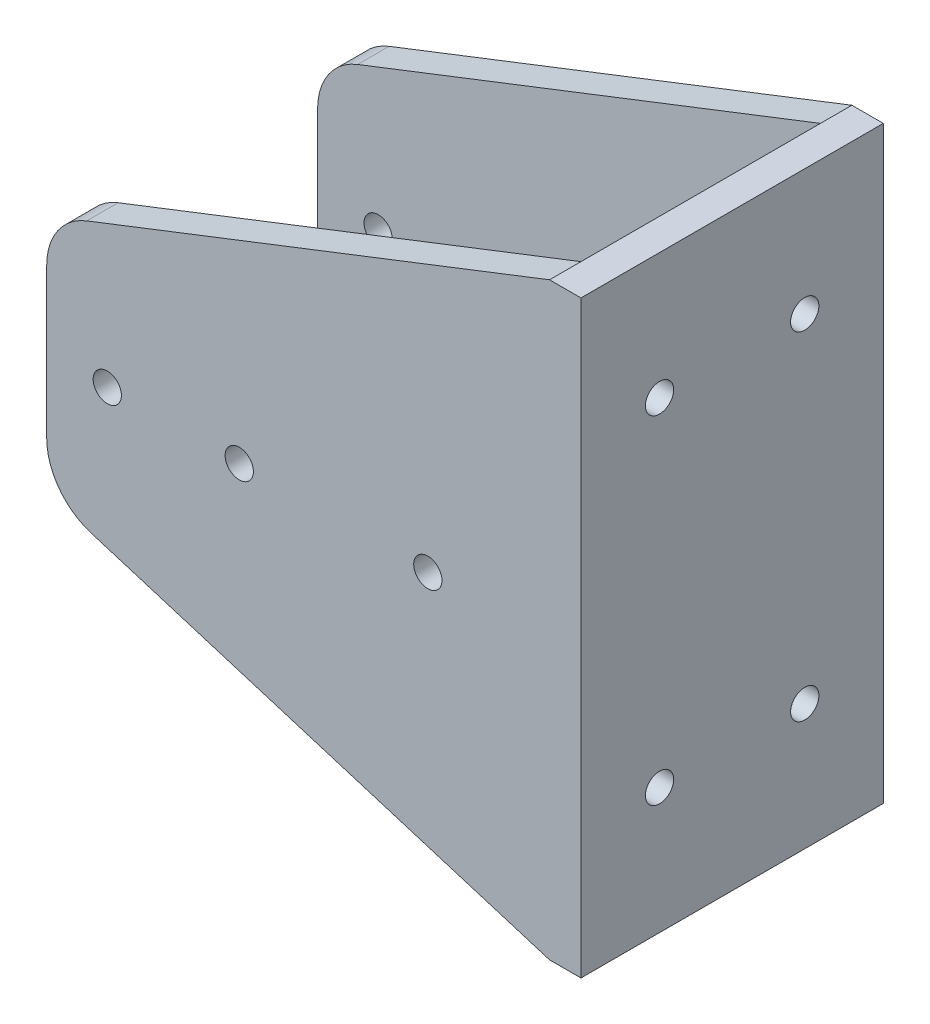
ISO-10303-21;
HEADER;
FILE_DESCRIPTION(('STEP AP214'),'2;1');
FILE_NAME('part.step','',(''),(''),'','','');
FILE_SCHEMA(('AUTOMOTIVE_DESIGN { 1 0 10303 214 1 1 1 1 }'));
ENDSEC;
DATA;
#1=APPLICATION_CONTEXT('core data for automotive mechanical design processes');
#2=APPLICATION_PROTOCOL_DEFINITION('international standard','automotive_design',2000,#1);
#3=PRODUCT_CONTEXT('',#1,'mechanical');
#4=PRODUCT('Part','Part','',(#3));
#5=PRODUCT_RELATED_PRODUCT_CATEGORY('part','',(#4));
#6=PRODUCT_DEFINITION_FORMATION('','',#4);
#7=PRODUCT_DEFINITION_CONTEXT('part definition',#1,'design');
#8=PRODUCT_DEFINITION('design','',#6,#7);
#9=PRODUCT_DEFINITION_SHAPE('','',#8);
#10=(LENGTH_UNIT() NAMED_UNIT(*) SI_UNIT(.MILLI.,.METRE.));
#11=(NAMED_UNIT(*) PLANE_ANGLE_UNIT() SI_UNIT($,.RADIAN.));
#12=(NAMED_UNIT(*) SI_UNIT($,.STERADIAN.) SOLID_ANGLE_UNIT());
#13=UNCERTAINTY_MEASURE_WITH_UNIT(LENGTH_MEASURE(1.E-05),#10,'distance_accuracy_value','');
#14=(GEOMETRIC_REPRESENTATION_CONTEXT(3) GLOBAL_UNCERTAINTY_ASSIGNED_CONTEXT((#13)) GLOBAL_UNIT_ASSIGNED_CONTEXT((#10,
#11,#12)) REPRESENTATION_CONTEXT('',''));
#15=CARTESIAN_POINT('',(0.,0.,0.));
#16=DIRECTION('',(0.,0.,1.));
#17=DIRECTION('',(1.,0.,0.));
#18=AXIS2_PLACEMENT_3D('',#15,#16,#17);
#19=CARTESIAN_POINT('',(-42.1605695000304,-11.8042707455189,5.));
#20=DIRECTION('',(0.,0.,1.));
#21=DIRECTION('',(1.,0.,0.));
#22=AXIS2_PLACEMENT_3D('',#19,#20,#21);
#23=PLANE('',#22);
#24=CARTESIAN_POINT('',(-21.5238143825873,0.,5.));
#25=DIRECTION('',(0.,0.,1.));
#26=DIRECTION('',(1.,0.,0.));
#27=AXIS2_PLACEMENT_3D('',#24,#25,#26);
#28=CIRCLE('',#27,2.25);
#29=CARTESIAN_POINT('',(-19.2738143825873,0.,5.));
#30=VERTEX_POINT('',#29);
#31=EDGE_CURVE('E198',#30,#30,#28,.T.);
#32=ORIENTED_EDGE('',*,*,#31,.F.);
#33=EDGE_LOOP('',(#32));
#34=FACE_BOUND('',#33,.T.);
#35=CARTESIAN_POINT('',(-42.1605695000304,-11.8042707455189,5.));
#36=DIRECTION('',(0.,0.,1.));
#37=DIRECTION('',(1.,0.,0.));
#38=AXIS2_PLACEMENT_3D('',#35,#36,#37);
#39=CIRCLE('',#38,10.);
#40=CARTESIAN_POINT('',(-52.1605695000304,-11.8042707455188,5.));
#41=VERTEX_POINT('',#40);
#42=CARTESIAN_POINT('',(-45.084961564147,-21.367111905725,5.));
#43=VERTEX_POINT('',#42);
#44=EDGE_CURVE('E142',#41,#43,#39,.T.);
#45=ORIENTED_EDGE('',*,*,#44,.T.);
#46=DIRECTION('',(0.956284116020608,-0.292439206411664,0.));
#47=VECTOR('',#46,1.);
#48=CARTESIAN_POINT('',(27.8394304999696,-43.6679647443428,5.));
#49=LINE('',#48,#47);
#50=CARTESIAN_POINT('',(27.8394304999696,-43.6679647443428,5.));
#51=VERTEX_POINT('',#50);
#52=EDGE_CURVE('E95',#43,#51,#49,.T.);
#53=ORIENTED_EDGE('',*,*,#52,.T.);
#54=DIRECTION('',(0.,1.,0.));
#55=VECTOR('',#54,1.);
#56=CARTESIAN_POINT('',(27.8394304999696,-43.6679647443428,5.));
#57=LINE('',#56,#55);
#58=CARTESIAN_POINT('',(27.8394304999696,50.,5.));
#59=VERTEX_POINT('',#58);
#60=EDGE_CURVE('E111',#51,#59,#57,.T.);
#61=ORIENTED_EDGE('',*,*,#60,.T.);
#62=DIRECTION('',(-0.931732044575127,-0.363146522924085,0.));
#63=VECTOR('',#62,1.);
#64=CARTESIAN_POINT('',(-45.7920347292712,21.3018235967214,5.));
#65=LINE('',#64,#63);
#66=CARTESIAN_POINT('',(-45.7920347292712,21.3018235967214,5.));
#67=VERTEX_POINT('',#66);
#68=EDGE_CURVE('E104',#59,#67,#65,.T.);
#69=ORIENTED_EDGE('',*,*,#68,.T.);
#70=CARTESIAN_POINT('',(-42.1605695000304,11.9845031509701,5.));
#71=DIRECTION('',(0.,0.,1.));
#72=DIRECTION('',(-1.,0.,0.));
#73=AXIS2_PLACEMENT_3D('',#70,#71,#72);
#74=CIRCLE('',#73,10.);
#75=CARTESIAN_POINT('',(-52.1605695000304,11.98450315097,5.));
#76=VERTEX_POINT('',#75);
#77=EDGE_CURVE('E108',#67,#76,#74,.T.);
#78=ORIENTED_EDGE('',*,*,#77,.T.);
#79=DIRECTION('',(0.,-1.,0.));
#80=VECTOR('',#79,1.);
#81=CARTESIAN_POINT('',(-52.1605695000304,-11.8042707455188,5.));
#82=LINE('',#81,#80);
#83=EDGE_CURVE('E63',#76,#41,#82,.T.);
#84=ORIENTED_EDGE('',*,*,#83,.T.);
#85=EDGE_LOOP('',(#45,#53,#61,#69,#78,#84));
#86=FACE_BOUND('',#85,.T.);
#87=CARTESIAN_POINT('',(-42.5238143825873,0.,5.));
#88=DIRECTION('',(0.,0.,1.));
#89=DIRECTION('',(1.,0.,0.));
#90=AXIS2_PLACEMENT_3D('',#87,#88,#89);
#91=CIRCLE('',#90,2.25);
#92=CARTESIAN_POINT('',(-40.2738143825873,0.,5.));
#93=VERTEX_POINT('',#92);
#94=EDGE_CURVE('E135',#93,#93,#91,.T.);
#95=ORIENTED_EDGE('',*,*,#94,.F.);
#96=EDGE_LOOP('',(#95));
#97=FACE_BOUND('',#96,.T.);
#98=CARTESIAN_POINT('',(8.47618561741272,0.,5.));
#99=DIRECTION('',(0.,0.,1.));
#100=DIRECTION('',(1.,0.,0.));
#101=AXIS2_PLACEMENT_3D('',#98,#99,#100);
#102=CIRCLE('',#101,2.25);
#103=CARTESIAN_POINT('',(10.7261856174127,0.,5.));
#104=VERTEX_POINT('',#103);
#105=EDGE_CURVE('E192',#104,#104,#102,.T.);
#106=ORIENTED_EDGE('',*,*,#105,.F.);
#107=EDGE_LOOP('',(#106));
#108=FACE_BOUND('',#107,.T.);
#109=ADVANCED_FACE('F39',(#34,#86,#97,#108),#23,.T.);
#110=CARTESIAN_POINT('',(-42.1605695000304,-11.8042707455189,0.));
#111=DIRECTION('',(0.,0.,1.));
#112=DIRECTION('',(1.,0.,0.));
#113=AXIS2_PLACEMENT_3D('',#110,#111,#112);
#114=PLANE('',#113);
#115=CARTESIAN_POINT('',(-42.1605695000304,-11.8042707455189,0.));
#116=DIRECTION('',(0.,0.,1.));
#117=DIRECTION('',(1.,0.,0.));
#118=AXIS2_PLACEMENT_3D('',#115,#116,#117);
#119=CIRCLE('',#118,10.);
#120=CARTESIAN_POINT('',(-52.1605695000304,-11.8042707455188,0.));
#121=VERTEX_POINT('',#120);
#122=CARTESIAN_POINT('',(-45.084961564147,-21.367111905725,0.));
#123=VERTEX_POINT('',#122);
#124=EDGE_CURVE('E131',#121,#123,#119,.T.);
#125=ORIENTED_EDGE('',*,*,#124,.F.);
#126=DIRECTION('',(0.,-1.,0.));
#127=VECTOR('',#126,1.);
#128=CARTESIAN_POINT('',(-52.1605695000304,-11.8042707455188,0.));
#129=LINE('',#128,#127);
#130=CARTESIAN_POINT('',(-52.1605695000304,11.98450315097,0.));
#131=VERTEX_POINT('',#130);
#132=EDGE_CURVE('E87',#131,#121,#129,.T.);
#133=ORIENTED_EDGE('',*,*,#132,.F.);
#134=CARTESIAN_POINT('',(-42.1605695000304,11.9845031509701,0.));
#135=DIRECTION('',(0.,0.,1.));
#136=DIRECTION('',(-1.,0.,0.));
#137=AXIS2_PLACEMENT_3D('',#134,#135,#136);
#138=CIRCLE('',#137,10.);
#139=CARTESIAN_POINT('',(-45.7920347292712,21.3018235967214,0.));
#140=VERTEX_POINT('',#139);
#141=EDGE_CURVE('E139',#140,#131,#138,.T.);
#142=ORIENTED_EDGE('',*,*,#141,.F.);
#143=DIRECTION('',(-0.931732044575127,-0.363146522924085,0.));
#144=VECTOR('',#143,1.);
#145=CARTESIAN_POINT('',(-45.7920347292712,21.3018235967214,0.));
#146=LINE('',#145,#144);
#147=CARTESIAN_POINT('',(27.8394304999696,50.,0.));
#148=VERTEX_POINT('',#147);
#149=EDGE_CURVE('E119',#148,#140,#146,.T.);
#150=ORIENTED_EDGE('',*,*,#149,.F.);
#151=DIRECTION('',(-1.,0.,0.));
#152=VECTOR('',#151,1.);
#153=CARTESIAN_POINT('',(32.8394304999696,50.,0.));
#154=LINE('',#153,#152);
#155=CARTESIAN_POINT('',(32.8394304999696,50.,0.));
#156=VERTEX_POINT('',#155);
#157=EDGE_CURVE('E188',#156,#148,#154,.T.);
#158=ORIENTED_EDGE('',*,*,#157,.F.);
#159=DIRECTION('',(0.,1.,0.));
#160=VECTOR('',#159,1.);
#161=CARTESIAN_POINT('',(32.8394304999696,50.,0.));
#162=LINE('',#161,#160);
#163=CARTESIAN_POINT('',(32.8394304999696,-43.7,0.));
#164=VERTEX_POINT('',#163);
#165=EDGE_CURVE('E180',#164,#156,#162,.T.);
#166=ORIENTED_EDGE('',*,*,#165,.F.);
#167=DIRECTION('',(-1.,0.,0.));
#168=VECTOR('',#167,1.);
#169=CARTESIAN_POINT('',(32.8394304999696,-43.7,0.));
#170=LINE('',#169,#168);
#171=CARTESIAN_POINT('',(27.8394304999696,-43.7,0.));
#172=VERTEX_POINT('',#171);
#173=EDGE_CURVE('E163',#164,#172,#170,.T.);
#174=ORIENTED_EDGE('',*,*,#173,.T.);
#175=DIRECTION('',(0.,1.,0.));
#176=VECTOR('',#175,1.);
#177=CARTESIAN_POINT('',(27.8394304999696,50.,0.));
#178=LINE('',#177,#176);
#179=CARTESIAN_POINT('',(27.8394304999696,-43.6679647443428,0.));
#180=VERTEX_POINT('',#179);
#181=EDGE_CURVE('E154',#172,#180,#178,.T.);
#182=ORIENTED_EDGE('',*,*,#181,.T.);
#183=DIRECTION('',(0.956284116020608,-0.292439206411664,0.));
#184=VECTOR('',#183,1.);
#185=CARTESIAN_POINT('',(27.8394304999696,-43.6679647443428,0.));
#186=LINE('',#185,#184);
#187=EDGE_CURVE('E134',#123,#180,#186,.T.);
#188=ORIENTED_EDGE('',*,*,#187,.F.);
#189=EDGE_LOOP('',(#125,#133,#142,#150,#158,#166,#174,#182,#188));
#190=FACE_BOUND('',#189,.T.);
#191=CARTESIAN_POINT('',(-42.5238143825873,0.,0.));
#192=DIRECTION('',(0.,0.,1.));
#193=DIRECTION('',(1.,0.,0.));
#194=AXIS2_PLACEMENT_3D('',#191,#192,#193);
#195=CIRCLE('',#194,2.25);
#196=CARTESIAN_POINT('',(-40.2738143825873,0.,0.));
#197=VERTEX_POINT('',#196);
#198=EDGE_CURVE('E201',#197,#197,#195,.T.);
#199=ORIENTED_EDGE('',*,*,#198,.T.);
#200=EDGE_LOOP('',(#199));
#201=FACE_BOUND('',#200,.T.);
#202=CARTESIAN_POINT('',(-21.5238143825873,0.,0.));
#203=DIRECTION('',(0.,0.,1.));
#204=DIRECTION('',(1.,0.,0.));
#205=AXIS2_PLACEMENT_3D('',#202,#203,#204);
#206=CIRCLE('',#205,2.25);
#207=CARTESIAN_POINT('',(-19.2738143825873,0.,0.));
#208=VERTEX_POINT('',#207);
#209=EDGE_CURVE('E195',#208,#208,#206,.T.);
#210=ORIENTED_EDGE('',*,*,#209,.T.);
#211=EDGE_LOOP('',(#210));
#212=FACE_BOUND('',#211,.T.);
#213=CARTESIAN_POINT('',(8.47618561741272,0.,0.));
#214=DIRECTION('',(0.,0.,1.));
#215=DIRECTION('',(1.,0.,0.));
#216=AXIS2_PLACEMENT_3D('',#213,#214,#215);
#217=CIRCLE('',#216,2.25);
#218=CARTESIAN_POINT('',(10.7261856174127,0.,0.));
#219=VERTEX_POINT('',#218);
#220=EDGE_CURVE('E191',#219,#219,#217,.T.);
#221=ORIENTED_EDGE('',*,*,#220,.T.);
#222=EDGE_LOOP('',(#221));
#223=FACE_BOUND('',#222,.T.);
#224=ADVANCED_FACE('F159',(#190,#201,#212,#223),#114,.F.);
#225=CARTESIAN_POINT('',(-42.1605695000304,-11.8042707455189,5.));
#226=DIRECTION('',(0.,0.,-1.));
#227=DIRECTION('',(-1.,0.,0.));
#228=AXIS2_PLACEMENT_3D('',#225,#226,#227);
#229=CYLINDRICAL_SURFACE('',#228,10.);
#230=ORIENTED_EDGE('',*,*,#124,.T.);
#231=DIRECTION('',(0.,0.,-1.));
#232=VECTOR('',#231,1.);
#233=CARTESIAN_POINT('',(-45.084961564147,-21.367111905725,5.));
#234=LINE('',#233,#232);
#235=EDGE_CURVE('E11',#43,#123,#234,.T.);
#236=ORIENTED_EDGE('',*,*,#235,.F.);
#237=ORIENTED_EDGE('',*,*,#44,.F.);
#238=DIRECTION('',(0.,0.,-1.));
#239=VECTOR('',#238,1.);
#240=CARTESIAN_POINT('',(-52.1605695000304,-11.8042707455188,5.));
#241=LINE('',#240,#239);
#242=EDGE_CURVE('E127',#41,#121,#241,.T.);
#243=ORIENTED_EDGE('',*,*,#242,.T.);
#244=EDGE_LOOP('',(#230,#236,#237,#243));
#245=FACE_BOUND('',#244,.T.);
#246=ADVANCED_FACE('F41',(#245),#229,.T.);
#247=CARTESIAN_POINT('',(27.8394304999696,-43.6679647443428,5.));
#248=DIRECTION('',(0.292439206411664,0.956284116020608,0.));
#249=DIRECTION('',(-0.956284116020609,0.292439206411664,0.));
#250=AXIS2_PLACEMENT_3D('',#247,#248,#249);
#251=PLANE('',#250);
#252=ORIENTED_EDGE('',*,*,#187,.T.);
#253=DIRECTION('',(0.,0.,-1.));
#254=VECTOR('',#253,1.);
#255=CARTESIAN_POINT('',(27.8394304999696,-43.6679647443428,5.));
#256=LINE('',#255,#254);
#257=EDGE_CURVE('E47',#51,#180,#256,.T.);
#258=ORIENTED_EDGE('',*,*,#257,.F.);
#259=ORIENTED_EDGE('',*,*,#52,.F.);
#260=ORIENTED_EDGE('',*,*,#235,.T.);
#261=EDGE_LOOP('',(#252,#258,#259,#260));
#262=FACE_BOUND('',#261,.T.);
#263=ADVANCED_FACE('F212',(#262),#251,.F.);
#264=CARTESIAN_POINT('',(-45.7920347292712,21.3018235967214,5.));
#265=DIRECTION('',(0.363146522924085,-0.931732044575127,0.));
#266=DIRECTION('',(0.931732044575127,0.363146522924085,0.));
#267=AXIS2_PLACEMENT_3D('',#264,#265,#266);
#268=PLANE('',#267);
#269=ORIENTED_EDGE('',*,*,#149,.T.);
#270=DIRECTION('',(0.,0.,-1.));
#271=VECTOR('',#270,1.);
#272=CARTESIAN_POINT('',(-45.7920347292712,21.3018235967214,5.));
#273=LINE('',#272,#271);
#274=EDGE_CURVE('E116',#67,#140,#273,.T.);
#275=ORIENTED_EDGE('',*,*,#274,.F.);
#276=ORIENTED_EDGE('',*,*,#68,.F.);
#277=DIRECTION('',(0.,0.,-1.));
#278=VECTOR('',#277,1.);
#279=CARTESIAN_POINT('',(27.8394304999696,50.,5.));
#280=LINE('',#279,#278);
#281=EDGE_CURVE('E122',#59,#148,#280,.T.);
#282=ORIENTED_EDGE('',*,*,#281,.T.);
#283=EDGE_LOOP('',(#269,#275,#276,#282));
#284=FACE_BOUND('',#283,.T.);
#285=ADVANCED_FACE('F117',(#284),#268,.F.);
#286=CARTESIAN_POINT('',(-42.1605695000304,11.9845031509701,5.));
#287=DIRECTION('',(0.,0.,-1.));
#288=DIRECTION('',(-1.,0.,0.));
#289=AXIS2_PLACEMENT_3D('',#286,#287,#288);
#290=CYLINDRICAL_SURFACE('',#289,10.);
#291=ORIENTED_EDGE('',*,*,#141,.T.);
#292=DIRECTION('',(0.,0.,-1.));
#293=VECTOR('',#292,1.);
#294=CARTESIAN_POINT('',(-52.1605695000304,11.98450315097,5.));
#295=LINE('',#294,#293);
#296=EDGE_CURVE('E123',#76,#131,#295,.T.);
#297=ORIENTED_EDGE('',*,*,#296,.F.);
#298=ORIENTED_EDGE('',*,*,#77,.F.);
#299=ORIENTED_EDGE('',*,*,#274,.T.);
#300=EDGE_LOOP('',(#291,#297,#298,#299));
#301=FACE_BOUND('',#300,.T.);
#302=ADVANCED_FACE('F125',(#301),#290,.T.);
#303=CARTESIAN_POINT('',(-52.1605695000304,-11.8042707455188,5.));
#304=DIRECTION('',(1.,0.,0.));
#305=DIRECTION('',(0.,1.,0.));
#306=AXIS2_PLACEMENT_3D('',#303,#304,#305);
#307=PLANE('',#306);
#308=ORIENTED_EDGE('',*,*,#132,.T.);
#309=ORIENTED_EDGE('',*,*,#242,.F.);
#310=ORIENTED_EDGE('',*,*,#83,.F.);
#311=ORIENTED_EDGE('',*,*,#296,.T.);
#312=EDGE_LOOP('',(#308,#309,#310,#311));
#313=FACE_BOUND('',#312,.T.);
#314=ADVANCED_FACE('F232',(#313),#307,.F.);
#315=CARTESIAN_POINT('',(-42.5238143825873,0.,5.));
#316=DIRECTION('',(0.,0.,-1.));
#317=DIRECTION('',(-1.,0.,0.));
#318=AXIS2_PLACEMENT_3D('',#315,#316,#317);
#319=CYLINDRICAL_SURFACE('',#318,2.25);
#320=ORIENTED_EDGE('',*,*,#94,.T.);
#321=EDGE_LOOP('',(#320));
#322=FACE_BOUND('',#321,.T.);
#323=ORIENTED_EDGE('',*,*,#198,.F.);
#324=EDGE_LOOP('',(#323));
#325=FACE_BOUND('',#324,.T.);
#326=ADVANCED_FACE('F229',(#322,#325),#319,.F.);
#327=CARTESIAN_POINT('',(-21.5238143825873,0.,5.));
#328=DIRECTION('',(0.,0.,-1.));
#329=DIRECTION('',(-1.,0.,0.));
#330=AXIS2_PLACEMENT_3D('',#327,#328,#329);
#331=CYLINDRICAL_SURFACE('',#330,2.25);
#332=ORIENTED_EDGE('',*,*,#31,.T.);
#333=EDGE_LOOP('',(#332));
#334=FACE_BOUND('',#333,.T.);
#335=ORIENTED_EDGE('',*,*,#209,.F.);
#336=EDGE_LOOP('',(#335));
#337=FACE_BOUND('',#336,.T.);
#338=ADVANCED_FACE('F253',(#334,#337),#331,.F.);
#339=CARTESIAN_POINT('',(8.47618561741272,0.,5.));
#340=DIRECTION('',(0.,0.,-1.));
#341=DIRECTION('',(-1.,0.,0.));
#342=AXIS2_PLACEMENT_3D('',#339,#340,#341);
#343=CYLINDRICAL_SURFACE('',#342,2.25);
#344=ORIENTED_EDGE('',*,*,#105,.T.);
#345=EDGE_LOOP('',(#344));
#346=FACE_BOUND('',#345,.T.);
#347=ORIENTED_EDGE('',*,*,#220,.F.);
#348=EDGE_LOOP('',(#347));
#349=FACE_BOUND('',#348,.T.);
#350=ADVANCED_FACE('F260',(#346,#349),#343,.F.);
#351=CARTESIAN_POINT('',(27.8394304999696,0.,0.));
#352=DIRECTION('',(-1.,0.,0.));
#353=DIRECTION('',(0.,-1.,0.));
#354=AXIS2_PLACEMENT_3D('',#351,#352,#353);
#355=PLANE('',#354);
#356=DIRECTION('',(0.,1.,0.));
#357=VECTOR('',#356,1.);
#358=CARTESIAN_POINT('',(27.8394304999696,50.,43.1));
#359=LINE('',#358,#357);
#360=CARTESIAN_POINT('',(27.8394304999696,-43.7,43.1));
#361=VERTEX_POINT('',#360);
#362=CARTESIAN_POINT('',(27.8394304999696,50.,43.1));
#363=VERTEX_POINT('',#362);
#364=EDGE_CURVE('E484',#361,#363,#359,.T.);
#365=ORIENTED_EDGE('',*,*,#364,.T.);
#366=DIRECTION('',(0.,0.,1.));
#367=VECTOR('',#366,1.);
#368=CARTESIAN_POINT('',(27.8394304999696,50.,0.));
#369=LINE('',#368,#367);
#370=EDGE_CURVE('E164',#59,#363,#369,.T.);
#371=ORIENTED_EDGE('',*,*,#370,.F.);
#372=ORIENTED_EDGE('',*,*,#60,.F.);
#373=ORIENTED_EDGE('',*,*,#257,.T.);
#374=ORIENTED_EDGE('',*,*,#181,.F.);
#375=DIRECTION('',(0.,0.,-1.));
#376=VECTOR('',#375,1.);
#377=CARTESIAN_POINT('',(27.8394304999696,-43.7,0.));
#378=LINE('',#377,#376);
#379=EDGE_CURVE('E168',#361,#172,#378,.T.);
#380=ORIENTED_EDGE('',*,*,#379,.F.);
#381=EDGE_LOOP('',(#365,#371,#372,#373,#374,#380));
#382=FACE_BOUND('',#381,.T.);
#383=CARTESIAN_POINT('',(27.8394304999696,-23.7,12.5));
#384=DIRECTION('',(1.,0.,0.));
#385=DIRECTION('',(0.,1.,0.));
#386=AXIS2_PLACEMENT_3D('',#383,#384,#385);
#387=CIRCLE('',#386,2.25);
#388=CARTESIAN_POINT('',(27.8394304999696,-21.45,12.5));
#389=VERTEX_POINT('',#388);
#390=EDGE_CURVE('E517',#389,#389,#387,.T.);
#391=ORIENTED_EDGE('',*,*,#390,.T.);
#392=EDGE_LOOP('',(#391));
#393=FACE_BOUND('',#392,.T.);
#394=CARTESIAN_POINT('',(27.8394304999696,30.,12.5));
#395=DIRECTION('',(1.,0.,0.));
#396=DIRECTION('',(0.,1.,0.));
#397=AXIS2_PLACEMENT_3D('',#394,#395,#396);
#398=CIRCLE('',#397,2.25);
#399=CARTESIAN_POINT('',(27.8394304999696,32.25,12.5));
#400=VERTEX_POINT('',#399);
#401=EDGE_CURVE('E538',#400,#400,#398,.T.);
#402=ORIENTED_EDGE('',*,*,#401,.T.);
#403=EDGE_LOOP('',(#402));
#404=FACE_BOUND('',#403,.T.);
#405=CARTESIAN_POINT('',(27.8394304999696,30.,35.6));
#406=DIRECTION('',(1.,0.,0.));
#407=DIRECTION('',(0.,1.,0.));
#408=AXIS2_PLACEMENT_3D('',#405,#406,#407);
#409=CIRCLE('',#408,2.25);
#410=CARTESIAN_POINT('',(27.8394304999696,32.25,35.6));
#411=VERTEX_POINT('',#410);
#412=EDGE_CURVE('E171',#411,#411,#409,.T.);
#413=ORIENTED_EDGE('',*,*,#412,.T.);
#414=EDGE_LOOP('',(#413));
#415=FACE_BOUND('',#414,.T.);
#416=CARTESIAN_POINT('',(27.8394304999696,-23.7,35.6));
#417=DIRECTION('',(1.,0.,0.));
#418=DIRECTION('',(0.,1.,0.));
#419=AXIS2_PLACEMENT_3D('',#416,#417,#418);
#420=CIRCLE('',#419,2.25);
#421=CARTESIAN_POINT('',(27.8394304999696,-21.45,35.6));
#422=VERTEX_POINT('',#421);
#423=EDGE_CURVE('E532',#422,#422,#420,.T.);
#424=ORIENTED_EDGE('',*,*,#423,.T.);
#425=EDGE_LOOP('',(#424));
#426=FACE_BOUND('',#425,.T.);
#427=ADVANCED_FACE('F150',(#382,#393,#404,#415,#426),#355,.T.);
#428=CARTESIAN_POINT('',(32.8394304999696,0.,0.));
#429=DIRECTION('',(-1.,0.,0.));
#430=DIRECTION('',(0.,-1.,0.));
#431=AXIS2_PLACEMENT_3D('',#428,#429,#430);
#432=PLANE('',#431);
#433=ORIENTED_EDGE('',*,*,#165,.T.);
#434=DIRECTION('',(0.,0.,1.));
#435=VECTOR('',#434,1.);
#436=CARTESIAN_POINT('',(32.8394304999696,50.,0.));
#437=LINE('',#436,#435);
#438=CARTESIAN_POINT('',(32.8394304999696,50.,48.1));
#439=VERTEX_POINT('',#438);
#440=EDGE_CURVE('E550',#156,#439,#437,.T.);
#441=ORIENTED_EDGE('',*,*,#440,.T.);
#442=DIRECTION('',(0.,-1.,0.));
#443=VECTOR('',#442,1.);
#444=CARTESIAN_POINT('',(32.8394304999696,50.,48.1));
#445=LINE('',#444,#443);
#446=CARTESIAN_POINT('',(32.8394304999696,-43.7,48.1));
#447=VERTEX_POINT('',#446);
#448=EDGE_CURVE('E552',#439,#447,#445,.T.);
#449=ORIENTED_EDGE('',*,*,#448,.T.);
#450=DIRECTION('',(0.,0.,-1.));
#451=VECTOR('',#450,1.);
#452=CARTESIAN_POINT('',(32.8394304999696,-43.7,0.));
#453=LINE('',#452,#451);
#454=EDGE_CURVE('E174',#447,#164,#453,.T.);
#455=ORIENTED_EDGE('',*,*,#454,.T.);
#456=EDGE_LOOP('',(#433,#441,#449,#455));
#457=FACE_BOUND('',#456,.T.);
#458=CARTESIAN_POINT('',(32.8394304999696,30.,35.6));
#459=DIRECTION('',(1.,0.,0.));
#460=DIRECTION('',(0.,1.,0.));
#461=AXIS2_PLACEMENT_3D('',#458,#459,#460);
#462=CIRCLE('',#461,2.25);
#463=CARTESIAN_POINT('',(32.8394304999696,32.25,35.6));
#464=VERTEX_POINT('',#463);
#465=EDGE_CURVE('E165',#464,#464,#462,.T.);
#466=ORIENTED_EDGE('',*,*,#465,.F.);
#467=EDGE_LOOP('',(#466));
#468=FACE_BOUND('',#467,.T.);
#469=CARTESIAN_POINT('',(32.8394304999696,30.,12.5));
#470=DIRECTION('',(1.,0.,0.));
#471=DIRECTION('',(0.,1.,0.));
#472=AXIS2_PLACEMENT_3D('',#469,#470,#471);
#473=CIRCLE('',#472,2.25);
#474=CARTESIAN_POINT('',(32.8394304999696,32.25,12.5));
#475=VERTEX_POINT('',#474);
#476=EDGE_CURVE('E541',#475,#475,#473,.T.);
#477=ORIENTED_EDGE('',*,*,#476,.F.);
#478=EDGE_LOOP('',(#477));
#479=FACE_BOUND('',#478,.T.);
#480=CARTESIAN_POINT('',(32.8394304999696,-23.7,35.6));
#481=DIRECTION('',(1.,0.,0.));
#482=DIRECTION('',(0.,1.,0.));
#483=AXIS2_PLACEMENT_3D('',#480,#481,#482);
#484=CIRCLE('',#483,2.25);
#485=CARTESIAN_POINT('',(32.8394304999696,-21.45,35.6));
#486=VERTEX_POINT('',#485);
#487=EDGE_CURVE('E535',#486,#486,#484,.T.);
#488=ORIENTED_EDGE('',*,*,#487,.F.);
#489=EDGE_LOOP('',(#488));
#490=FACE_BOUND('',#489,.T.);
#491=CARTESIAN_POINT('',(32.8394304999696,-23.7,12.5));
#492=DIRECTION('',(1.,0.,0.));
#493=DIRECTION('',(0.,1.,0.));
#494=AXIS2_PLACEMENT_3D('',#491,#492,#493);
#495=CIRCLE('',#494,2.25);
#496=CARTESIAN_POINT('',(32.8394304999696,-21.45,12.5));
#497=VERTEX_POINT('',#496);
#498=EDGE_CURVE('E529',#497,#497,#495,.T.);
#499=ORIENTED_EDGE('',*,*,#498,.F.);
#500=EDGE_LOOP('',(#499));
#501=FACE_BOUND('',#500,.T.);
#502=ADVANCED_FACE('F287',(#457,#468,#479,#490,#501),#432,.F.);
#503=CARTESIAN_POINT('',(32.8394304999696,50.,0.));
#504=DIRECTION('',(0.,-1.,0.));
#505=DIRECTION('',(1.,0.,0.));
#506=AXIS2_PLACEMENT_3D('',#503,#504,#505);
#507=PLANE('',#506);
#508=ORIENTED_EDGE('',*,*,#281,.F.);
#509=ORIENTED_EDGE('',*,*,#370,.T.);
#510=DIRECTION('',(0.,0.,1.));
#511=VECTOR('',#510,1.);
#512=CARTESIAN_POINT('',(27.8394304999696,50.,43.1));
#513=LINE('',#512,#511);
#514=CARTESIAN_POINT('',(27.8394304999696,50.,48.1));
#515=VERTEX_POINT('',#514);
#516=EDGE_CURVE('E500',#363,#515,#513,.T.);
#517=ORIENTED_EDGE('',*,*,#516,.T.);
#518=DIRECTION('',(-1.,0.,0.));
#519=VECTOR('',#518,1.);
#520=CARTESIAN_POINT('',(32.8394304999696,50.,48.1));
#521=LINE('',#520,#519);
#522=EDGE_CURVE('E185',#439,#515,#521,.T.);
#523=ORIENTED_EDGE('',*,*,#522,.F.);
#524=ORIENTED_EDGE('',*,*,#440,.F.);
#525=ORIENTED_EDGE('',*,*,#157,.T.);
#526=EDGE_LOOP('',(#508,#509,#517,#523,#524,#525));
#527=FACE_BOUND('',#526,.T.);
#528=ADVANCED_FACE('F298',(#527),#507,.F.);
#529=CARTESIAN_POINT('',(32.8394304999696,50.,48.1));
#530=DIRECTION('',(0.,0.,-1.));
#531=DIRECTION('',(0.,1.,0.));
#532=AXIS2_PLACEMENT_3D('',#529,#530,#531);
#533=PLANE('',#532);
#534=ORIENTED_EDGE('',*,*,#522,.T.);
#535=DIRECTION('',(-0.931732044575127,-0.363146522924085,0.));
#536=VECTOR('',#535,1.);
#537=CARTESIAN_POINT('',(27.8394304999696,50.,48.1));
#538=LINE('',#537,#536);
#539=CARTESIAN_POINT('',(-45.7920347292712,21.3018235967214,48.1));
#540=VERTEX_POINT('',#539);
#541=EDGE_CURVE('E481',#515,#540,#538,.T.);
#542=ORIENTED_EDGE('',*,*,#541,.T.);
#543=CARTESIAN_POINT('',(-42.1605695000304,11.9845031509701,48.1));
#544=DIRECTION('',(0.,0.,1.));
#545=DIRECTION('',(-1.,0.,0.));
#546=AXIS2_PLACEMENT_3D('',#543,#544,#545);
#547=CIRCLE('',#546,10.);
#548=CARTESIAN_POINT('',(-52.1605695000304,11.9845031509701,48.1));
#549=VERTEX_POINT('',#548);
#550=EDGE_CURVE('E503',#540,#549,#547,.T.);
#551=ORIENTED_EDGE('',*,*,#550,.T.);
#552=DIRECTION('',(0.,-1.,0.));
#553=VECTOR('',#552,1.);
#554=CARTESIAN_POINT('',(-52.1605695000304,-11.8042707455188,48.1));
#555=LINE('',#554,#553);
#556=CARTESIAN_POINT('',(-52.1605695000304,-11.8042707455188,48.1));
#557=VERTEX_POINT('',#556);
#558=EDGE_CURVE('E506',#549,#557,#555,.T.);
#559=ORIENTED_EDGE('',*,*,#558,.T.);
#560=CARTESIAN_POINT('',(-42.1605695000304,-11.8042707455189,48.1));
#561=DIRECTION('',(0.,0.,1.));
#562=DIRECTION('',(-1.,0.,0.));
#563=AXIS2_PLACEMENT_3D('',#560,#561,#562);
#564=CIRCLE('',#563,10.);
#565=CARTESIAN_POINT('',(-45.084961564147,-21.367111905725,48.1));
#566=VERTEX_POINT('',#565);
#567=EDGE_CURVE('E509',#557,#566,#564,.T.);
#568=ORIENTED_EDGE('',*,*,#567,.T.);
#569=DIRECTION('',(0.956166573066795,-0.292823299192023,0.));
#570=VECTOR('',#569,1.);
#571=CARTESIAN_POINT('',(27.8394304999696,-43.7,48.1));
#572=LINE('',#571,#570);
#573=CARTESIAN_POINT('',(27.8394304999696,-43.7,48.1));
#574=VERTEX_POINT('',#573);
#575=EDGE_CURVE('E487',#566,#574,#572,.T.);
#576=ORIENTED_EDGE('',*,*,#575,.T.);
#577=DIRECTION('',(-1.,0.,0.));
#578=VECTOR('',#577,1.);
#579=CARTESIAN_POINT('',(32.8394304999696,-43.7,48.1));
#580=LINE('',#579,#578);
#581=EDGE_CURVE('E182',#447,#574,#580,.T.);
#582=ORIENTED_EDGE('',*,*,#581,.F.);
#583=ORIENTED_EDGE('',*,*,#448,.F.);
#584=EDGE_LOOP('',(#534,#542,#551,#559,#568,#576,#582,#583));
#585=FACE_BOUND('',#584,.T.);
#586=CARTESIAN_POINT('',(8.47618561741272,0.,48.1));
#587=DIRECTION('',(0.,0.,1.));
#588=DIRECTION('',(1.,0.,0.));
#589=AXIS2_PLACEMENT_3D('',#586,#587,#588);
#590=CIRCLE('',#589,2.25);
#591=CARTESIAN_POINT('',(10.7261856174127,0.,48.1));
#592=VERTEX_POINT('',#591);
#593=EDGE_CURVE('E466',#592,#592,#590,.T.);
#594=ORIENTED_EDGE('',*,*,#593,.F.);
#595=EDGE_LOOP('',(#594));
#596=FACE_BOUND('',#595,.T.);
#597=CARTESIAN_POINT('',(-42.5238143825873,0.,48.1));
#598=DIRECTION('',(0.,0.,1.));
#599=DIRECTION('',(1.,0.,0.));
#600=AXIS2_PLACEMENT_3D('',#597,#598,#599);
#601=CIRCLE('',#600,2.25);
#602=CARTESIAN_POINT('',(-40.2738143825873,0.,48.1));
#603=VERTEX_POINT('',#602);
#604=EDGE_CURVE('E469',#603,#603,#601,.T.);
#605=ORIENTED_EDGE('',*,*,#604,.F.);
#606=EDGE_LOOP('',(#605));
#607=FACE_BOUND('',#606,.T.);
#608=CARTESIAN_POINT('',(-21.5238143825873,0.,48.1));
#609=DIRECTION('',(0.,0.,1.));
#610=DIRECTION('',(1.,0.,0.));
#611=AXIS2_PLACEMENT_3D('',#608,#609,#610);
#612=CIRCLE('',#611,2.25);
#613=CARTESIAN_POINT('',(-19.2738143825873,0.,48.1));
#614=VERTEX_POINT('',#613);
#615=EDGE_CURVE('E475',#614,#614,#612,.T.);
#616=ORIENTED_EDGE('',*,*,#615,.F.);
#617=EDGE_LOOP('',(#616));
#618=FACE_BOUND('',#617,.T.);
#619=ADVANCED_FACE('F308',(#585,#596,#607,#618),#533,.F.);
#620=CARTESIAN_POINT('',(32.8394304999696,-43.7,0.));
#621=DIRECTION('',(0.,1.,0.));
#622=DIRECTION('',(0.,0.,1.));
#623=AXIS2_PLACEMENT_3D('',#620,#621,#622);
#624=PLANE('',#623);
#625=EDGE_CURVE('E177',#574,#361,#378,.T.);
#626=ORIENTED_EDGE('',*,*,#625,.T.);
#627=ORIENTED_EDGE('',*,*,#379,.T.);
#628=ORIENTED_EDGE('',*,*,#173,.F.);
#629=ORIENTED_EDGE('',*,*,#454,.F.);
#630=ORIENTED_EDGE('',*,*,#581,.T.);
#631=EDGE_LOOP('',(#626,#627,#628,#629,#630));
#632=FACE_BOUND('',#631,.T.);
#633=ADVANCED_FACE('F319',(#632),#624,.F.);
#634=CARTESIAN_POINT('',(32.8394304999696,30.,35.6));
#635=DIRECTION('',(-1.,0.,0.));
#636=DIRECTION('',(0.,-1.,0.));
#637=AXIS2_PLACEMENT_3D('',#634,#635,#636);
#638=CYLINDRICAL_SURFACE('',#637,2.25);
#639=ORIENTED_EDGE('',*,*,#465,.T.);
#640=EDGE_LOOP('',(#639));
#641=FACE_BOUND('',#640,.T.);
#642=ORIENTED_EDGE('',*,*,#412,.F.);
#643=EDGE_LOOP('',(#642));
#644=FACE_BOUND('',#643,.T.);
#645=ADVANCED_FACE('F332',(#641,#644),#638,.F.);
#646=CARTESIAN_POINT('',(32.8394304999696,30.,12.5));
#647=DIRECTION('',(-1.,0.,0.));
#648=DIRECTION('',(0.,-1.,0.));
#649=AXIS2_PLACEMENT_3D('',#646,#647,#648);
#650=CYLINDRICAL_SURFACE('',#649,2.25);
#651=ORIENTED_EDGE('',*,*,#476,.T.);
#652=EDGE_LOOP('',(#651));
#653=FACE_BOUND('',#652,.T.);
#654=ORIENTED_EDGE('',*,*,#401,.F.);
#655=EDGE_LOOP('',(#654));
#656=FACE_BOUND('',#655,.T.);
#657=ADVANCED_FACE('F342',(#653,#656),#650,.F.);
#658=CARTESIAN_POINT('',(32.8394304999696,-23.7,35.6));
#659=DIRECTION('',(-1.,0.,0.));
#660=DIRECTION('',(0.,-1.,0.));
#661=AXIS2_PLACEMENT_3D('',#658,#659,#660);
#662=CYLINDRICAL_SURFACE('',#661,2.25);
#663=ORIENTED_EDGE('',*,*,#487,.T.);
#664=EDGE_LOOP('',(#663));
#665=FACE_BOUND('',#664,.T.);
#666=ORIENTED_EDGE('',*,*,#423,.F.);
#667=EDGE_LOOP('',(#666));
#668=FACE_BOUND('',#667,.T.);
#669=ADVANCED_FACE('F352',(#665,#668),#662,.F.);
#670=CARTESIAN_POINT('',(32.8394304999696,-23.7,12.5));
#671=DIRECTION('',(-1.,0.,0.));
#672=DIRECTION('',(0.,-1.,0.));
#673=AXIS2_PLACEMENT_3D('',#670,#671,#672);
#674=CYLINDRICAL_SURFACE('',#673,2.25);
#675=ORIENTED_EDGE('',*,*,#498,.T.);
#676=EDGE_LOOP('',(#675));
#677=FACE_BOUND('',#676,.T.);
#678=ORIENTED_EDGE('',*,*,#390,.F.);
#679=EDGE_LOOP('',(#678));
#680=FACE_BOUND('',#679,.T.);
#681=ADVANCED_FACE('F361',(#677,#680),#674,.F.);
#682=CARTESIAN_POINT('',(27.8394304999696,-43.7,43.1));
#683=DIRECTION('',(-0.292823299192023,-0.956166573066795,0.));
#684=DIRECTION('',(0.956166573066795,-0.292823299192023,0.));
#685=AXIS2_PLACEMENT_3D('',#682,#683,#684);
#686=PLANE('',#685);
#687=ORIENTED_EDGE('',*,*,#575,.F.);
#688=DIRECTION('',(0.,0.,1.));
#689=VECTOR('',#688,1.);
#690=CARTESIAN_POINT('',(-45.084961564147,-21.367111905725,43.1));
#691=LINE('',#690,#689);
#692=CARTESIAN_POINT('',(-45.084961564147,-21.367111905725,43.1));
#693=VERTEX_POINT('',#692);
#694=EDGE_CURVE('E514',#693,#566,#691,.T.);
#695=ORIENTED_EDGE('',*,*,#694,.F.);
#696=DIRECTION('',(0.956166573066795,-0.292823299192023,0.));
#697=VECTOR('',#696,1.);
#698=CARTESIAN_POINT('',(27.8394304999696,-43.7,43.1));
#699=LINE('',#698,#697);
#700=EDGE_CURVE('E54',#693,#361,#699,.T.);
#701=ORIENTED_EDGE('',*,*,#700,.T.);
#702=ORIENTED_EDGE('',*,*,#625,.F.);
#703=EDGE_LOOP('',(#687,#695,#701,#702));
#704=FACE_BOUND('',#703,.T.);
#705=ADVANCED_FACE('F369',(#704),#686,.T.);
#706=CARTESIAN_POINT('',(-42.1605695000304,-11.8042707455189,43.1));
#707=DIRECTION('',(0.,0.,1.));
#708=DIRECTION('',(1.,0.,0.));
#709=AXIS2_PLACEMENT_3D('',#706,#707,#708);
#710=CYLINDRICAL_SURFACE('',#709,10.);
#711=ORIENTED_EDGE('',*,*,#567,.F.);
#712=DIRECTION('',(0.,0.,1.));
#713=VECTOR('',#712,1.);
#714=CARTESIAN_POINT('',(-52.1605695000304,-11.8042707455188,43.1));
#715=LINE('',#714,#713);
#716=CARTESIAN_POINT('',(-52.1605695000304,-11.8042707455188,43.1));
#717=VERTEX_POINT('',#716);
#718=EDGE_CURVE('E518',#717,#557,#715,.T.);
#719=ORIENTED_EDGE('',*,*,#718,.F.);
#720=CARTESIAN_POINT('',(-42.1605695000304,-11.8042707455189,43.1));
#721=DIRECTION('',(0.,0.,1.));
#722=DIRECTION('',(-1.,0.,0.));
#723=AXIS2_PLACEMENT_3D('',#720,#721,#722);
#724=CIRCLE('',#723,10.);
#725=EDGE_CURVE('E496',#717,#693,#724,.T.);
#726=ORIENTED_EDGE('',*,*,#725,.T.);
#727=ORIENTED_EDGE('',*,*,#694,.T.);
#728=EDGE_LOOP('',(#711,#719,#726,#727));
#729=FACE_BOUND('',#728,.T.);
#730=ADVANCED_FACE('F377',(#729),#710,.T.);
#731=CARTESIAN_POINT('',(-52.1605695000304,-11.8042707455188,43.1));
#732=DIRECTION('',(-1.,0.,0.));
#733=DIRECTION('',(0.,-1.,0.));
#734=AXIS2_PLACEMENT_3D('',#731,#732,#733);
#735=PLANE('',#734);
#736=ORIENTED_EDGE('',*,*,#558,.F.);
#737=DIRECTION('',(0.,0.,1.));
#738=VECTOR('',#737,1.);
#739=CARTESIAN_POINT('',(-52.1605695000304,11.9845031509701,43.1));
#740=LINE('',#739,#738);
#741=CARTESIAN_POINT('',(-52.1605695000304,11.9845031509701,43.1));
#742=VERTEX_POINT('',#741);
#743=EDGE_CURVE('E521',#742,#549,#740,.T.);
#744=ORIENTED_EDGE('',*,*,#743,.F.);
#745=DIRECTION('',(0.,-1.,0.));
#746=VECTOR('',#745,1.);
#747=CARTESIAN_POINT('',(-52.1605695000304,-11.8042707455188,43.1));
#748=LINE('',#747,#746);
#749=EDGE_CURVE('E493',#742,#717,#748,.T.);
#750=ORIENTED_EDGE('',*,*,#749,.T.);
#751=ORIENTED_EDGE('',*,*,#718,.T.);
#752=EDGE_LOOP('',(#736,#744,#750,#751));
#753=FACE_BOUND('',#752,.T.);
#754=ADVANCED_FACE('F385',(#753),#735,.T.);
#755=CARTESIAN_POINT('',(-42.1605695000304,11.9845031509701,43.1));
#756=DIRECTION('',(0.,0.,1.));
#757=DIRECTION('',(1.,0.,0.));
#758=AXIS2_PLACEMENT_3D('',#755,#756,#757);
#759=CYLINDRICAL_SURFACE('',#758,10.);
#760=ORIENTED_EDGE('',*,*,#550,.F.);
#761=DIRECTION('',(0.,0.,1.));
#762=VECTOR('',#761,1.);
#763=CARTESIAN_POINT('',(-45.7920347292712,21.3018235967214,43.1));
#764=LINE('',#763,#762);
#765=CARTESIAN_POINT('',(-45.7920347292712,21.3018235967214,43.1));
#766=VERTEX_POINT('',#765);
#767=EDGE_CURVE('E524',#766,#540,#764,.T.);
#768=ORIENTED_EDGE('',*,*,#767,.F.);
#769=CARTESIAN_POINT('',(-42.1605695000304,11.9845031509701,43.1));
#770=DIRECTION('',(0.,0.,1.));
#771=DIRECTION('',(-1.,0.,0.));
#772=AXIS2_PLACEMENT_3D('',#769,#770,#771);
#773=CIRCLE('',#772,10.);
#774=EDGE_CURVE('E490',#766,#742,#773,.T.);
#775=ORIENTED_EDGE('',*,*,#774,.T.);
#776=ORIENTED_EDGE('',*,*,#743,.T.);
#777=EDGE_LOOP('',(#760,#768,#775,#776));
#778=FACE_BOUND('',#777,.T.);
#779=ADVANCED_FACE('F394',(#778),#759,.T.);
#780=CARTESIAN_POINT('',(27.8394304999696,50.,43.1));
#781=DIRECTION('',(-0.363146522924085,0.931732044575127,0.));
#782=DIRECTION('',(-0.931732044575127,-0.363146522924085,0.));
#783=AXIS2_PLACEMENT_3D('',#780,#781,#782);
#784=PLANE('',#783);
#785=ORIENTED_EDGE('',*,*,#541,.F.);
#786=ORIENTED_EDGE('',*,*,#516,.F.);
#787=DIRECTION('',(-0.931732044575127,-0.363146522924085,0.));
#788=VECTOR('',#787,1.);
#789=CARTESIAN_POINT('',(27.8394304999696,50.,43.1));
#790=LINE('',#789,#788);
#791=EDGE_CURVE('E486',#363,#766,#790,.T.);
#792=ORIENTED_EDGE('',*,*,#791,.T.);
#793=ORIENTED_EDGE('',*,*,#767,.T.);
#794=EDGE_LOOP('',(#785,#786,#792,#793));
#795=FACE_BOUND('',#794,.T.);
#796=ADVANCED_FACE('F403',(#795),#784,.T.);
#797=CARTESIAN_POINT('',(-42.1605695000304,-11.8042707455189,43.1));
#798=DIRECTION('',(0.,0.,-1.));
#799=DIRECTION('',(-1.,0.,0.));
#800=AXIS2_PLACEMENT_3D('',#797,#798,#799);
#801=PLANE('',#800);
#802=CARTESIAN_POINT('',(8.47618561741272,0.,43.1));
#803=DIRECTION('',(0.,0.,1.));
#804=DIRECTION('',(1.,0.,0.));
#805=AXIS2_PLACEMENT_3D('',#802,#803,#804);
#806=CIRCLE('',#805,2.25);
#807=CARTESIAN_POINT('',(10.7261856174127,0.,43.1));
#808=VERTEX_POINT('',#807);
#809=EDGE_CURVE('E463',#808,#808,#806,.T.);
#810=ORIENTED_EDGE('',*,*,#809,.T.);
#811=EDGE_LOOP('',(#810));
#812=FACE_BOUND('',#811,.T.);
#813=CARTESIAN_POINT('',(-42.5238143825873,0.,43.1));
#814=DIRECTION('',(0.,0.,1.));
#815=DIRECTION('',(1.,0.,0.));
#816=AXIS2_PLACEMENT_3D('',#813,#814,#815);
#817=CIRCLE('',#816,2.25);
#818=CARTESIAN_POINT('',(-40.2738143825873,0.,43.1));
#819=VERTEX_POINT('',#818);
#820=EDGE_CURVE('E472',#819,#819,#817,.T.);
#821=ORIENTED_EDGE('',*,*,#820,.T.);
#822=EDGE_LOOP('',(#821));
#823=FACE_BOUND('',#822,.T.);
#824=CARTESIAN_POINT('',(-21.5238143825873,0.,43.1));
#825=DIRECTION('',(0.,0.,1.));
#826=DIRECTION('',(1.,0.,0.));
#827=AXIS2_PLACEMENT_3D('',#824,#825,#826);
#828=CIRCLE('',#827,2.25);
#829=CARTESIAN_POINT('',(-19.2738143825873,0.,43.1));
#830=VERTEX_POINT('',#829);
#831=EDGE_CURVE('E478',#830,#830,#828,.T.);
#832=ORIENTED_EDGE('',*,*,#831,.T.);
#833=EDGE_LOOP('',(#832));
#834=FACE_BOUND('',#833,.T.);
#835=ORIENTED_EDGE('',*,*,#364,.F.);
#836=ORIENTED_EDGE('',*,*,#700,.F.);
#837=ORIENTED_EDGE('',*,*,#725,.F.);
#838=ORIENTED_EDGE('',*,*,#749,.F.);
#839=ORIENTED_EDGE('',*,*,#774,.F.);
#840=ORIENTED_EDGE('',*,*,#791,.F.);
#841=EDGE_LOOP('',(#835,#836,#837,#838,#839,#840));
#842=FACE_BOUND('',#841,.T.);
#843=ADVANCED_FACE('F412',(#812,#823,#834,#842),#801,.T.);
#844=CARTESIAN_POINT('',(-21.5238143825873,0.,43.1));
#845=DIRECTION('',(0.,0.,1.));
#846=DIRECTION('',(1.,0.,0.));
#847=AXIS2_PLACEMENT_3D('',#844,#845,#846);
#848=CYLINDRICAL_SURFACE('',#847,2.25);
#849=ORIENTED_EDGE('',*,*,#831,.F.);
#850=EDGE_LOOP('',(#849));
#851=FACE_BOUND('',#850,.T.);
#852=ORIENTED_EDGE('',*,*,#615,.T.);
#853=EDGE_LOOP('',(#852));
#854=FACE_BOUND('',#853,.T.);
#855=ADVANCED_FACE('F421',(#851,#854),#848,.F.);
#856=CARTESIAN_POINT('',(-42.5238143825873,0.,43.1));
#857=DIRECTION('',(0.,0.,1.));
#858=DIRECTION('',(1.,0.,0.));
#859=AXIS2_PLACEMENT_3D('',#856,#857,#858);
#860=CYLINDRICAL_SURFACE('',#859,2.25);
#861=ORIENTED_EDGE('',*,*,#820,.F.);
#862=EDGE_LOOP('',(#861));
#863=FACE_BOUND('',#862,.T.);
#864=ORIENTED_EDGE('',*,*,#604,.T.);
#865=EDGE_LOOP('',(#864));
#866=FACE_BOUND('',#865,.T.);
#867=ADVANCED_FACE('F430',(#863,#866),#860,.F.);
#868=CARTESIAN_POINT('',(8.47618561741272,0.,43.1));
#869=DIRECTION('',(0.,0.,1.));
#870=DIRECTION('',(1.,0.,0.));
#871=AXIS2_PLACEMENT_3D('',#868,#869,#870);
#872=CYLINDRICAL_SURFACE('',#871,2.25);
#873=ORIENTED_EDGE('',*,*,#809,.F.);
#874=EDGE_LOOP('',(#873));
#875=FACE_BOUND('',#874,.T.);
#876=ORIENTED_EDGE('',*,*,#593,.T.);
#877=EDGE_LOOP('',(#876));
#878=FACE_BOUND('',#877,.T.);
#879=ADVANCED_FACE('F439',(#875,#878),#872,.F.);
#880=CLOSED_SHELL('',(#109,#224,#246,#263,#285,#302,#314,#326,#338,#350,#427,#502,#528,#619,
#633,#645,#657,#669,#681,#705,#730,#754,#779,#796,#843,#855,#867,#879));
#881=MANIFOLD_SOLID_BREP('B2',#880);
#882=ADVANCED_BREP_SHAPE_REPRESENTATION('',(#18,#881),#14);
#883=SHAPE_DEFINITION_REPRESENTATION(#9,#882);
ENDSEC;
END-ISO-10303-21;
